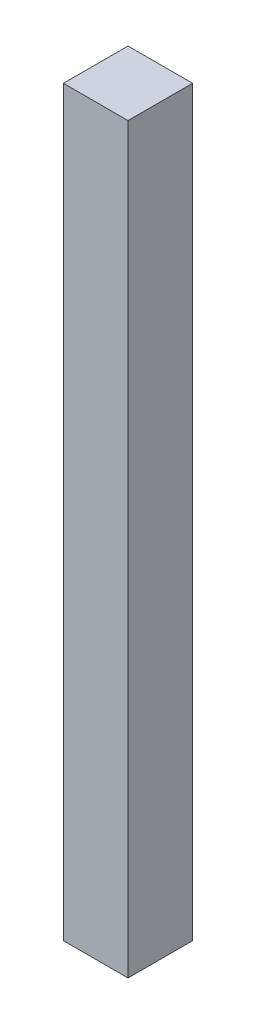
ISO-10303-21;
HEADER;
FILE_DESCRIPTION(('STEP AP214'),'2;1');
FILE_NAME('part.step','',(''),(''),'','','');
FILE_SCHEMA(('AUTOMOTIVE_DESIGN { 1 0 10303 214 1 1 1 1 }'));
ENDSEC;
DATA;
#1=APPLICATION_CONTEXT('core data for automotive mechanical design processes');
#2=APPLICATION_PROTOCOL_DEFINITION('international standard','automotive_design',2000,#1);
#3=PRODUCT_CONTEXT('',#1,'mechanical');
#4=PRODUCT('Part','Part','',(#3));
#5=PRODUCT_RELATED_PRODUCT_CATEGORY('part','',(#4));
#6=PRODUCT_DEFINITION_FORMATION('','',#4);
#7=PRODUCT_DEFINITION_CONTEXT('part definition',#1,'design');
#8=PRODUCT_DEFINITION('design','',#6,#7);
#9=PRODUCT_DEFINITION_SHAPE('','',#8);
#10=(LENGTH_UNIT() NAMED_UNIT(*) SI_UNIT(.MILLI.,.METRE.));
#11=(NAMED_UNIT(*) PLANE_ANGLE_UNIT() SI_UNIT($,.RADIAN.));
#12=(NAMED_UNIT(*) SI_UNIT($,.STERADIAN.) SOLID_ANGLE_UNIT());
#13=UNCERTAINTY_MEASURE_WITH_UNIT(LENGTH_MEASURE(1.E-05),#10,'distance_accuracy_value','');
#14=(GEOMETRIC_REPRESENTATION_CONTEXT(3) GLOBAL_UNCERTAINTY_ASSIGNED_CONTEXT((#13)) GLOBAL_UNIT_ASSIGNED_CONTEXT((#10,
#11,#12)) REPRESENTATION_CONTEXT('',''));
#15=CARTESIAN_POINT('',(0.,0.,0.));
#16=DIRECTION('',(0.,0.,1.));
#17=DIRECTION('',(1.,0.,0.));
#18=AXIS2_PLACEMENT_3D('',#15,#16,#17);
#19=CARTESIAN_POINT('',(50.,-287.5,25.0000000000001));
#20=DIRECTION('',(0.,0.,-1.));
#21=DIRECTION('',(-1.,0.,0.));
#22=AXIS2_PLACEMENT_3D('',#19,#20,#21);
#23=PLANE('',#22);
#24=DIRECTION('',(0.,-1.,0.));
#25=VECTOR('',#24,1.);
#26=CARTESIAN_POINT('',(0.,-287.5,25.0000000000001));
#27=LINE('',#26,#25);
#28=CARTESIAN_POINT('',(0.,287.5,25.0000000000001));
#29=VERTEX_POINT('',#28);
#30=CARTESIAN_POINT('',(0.,-287.5,25.0000000000001));
#31=VERTEX_POINT('',#30);
#32=EDGE_CURVE('E102',#29,#31,#27,.T.);
#33=ORIENTED_EDGE('',*,*,#32,.T.);
#34=DIRECTION('',(-1.,0.,0.));
#35=VECTOR('',#34,1.);
#36=CARTESIAN_POINT('',(50.,-287.5,25.0000000000001));
#37=LINE('',#36,#35);
#38=CARTESIAN_POINT('',(50.,-287.5,25.0000000000001));
#39=VERTEX_POINT('',#38);
#40=EDGE_CURVE('E11',#39,#31,#37,.T.);
#41=ORIENTED_EDGE('',*,*,#40,.F.);
#42=DIRECTION('',(0.,-1.,0.));
#43=VECTOR('',#42,1.);
#44=CARTESIAN_POINT('',(50.,-287.5,25.0000000000001));
#45=LINE('',#44,#43);
#46=CARTESIAN_POINT('',(50.,287.5,25.0000000000001));
#47=VERTEX_POINT('',#46);
#48=EDGE_CURVE('E90',#47,#39,#45,.T.);
#49=ORIENTED_EDGE('',*,*,#48,.F.);
#50=DIRECTION('',(-1.,0.,0.));
#51=VECTOR('',#50,1.);
#52=CARTESIAN_POINT('',(50.,287.5,25.0000000000001));
#53=LINE('',#52,#51);
#54=EDGE_CURVE('E98',#47,#29,#53,.T.);
#55=ORIENTED_EDGE('',*,*,#54,.T.);
#56=EDGE_LOOP('',(#33,#41,#49,#55));
#57=FACE_BOUND('',#56,.T.);
#58=ADVANCED_FACE('F39',(#57),#23,.F.);
#59=CARTESIAN_POINT('',(50.,-287.5,-24.9999999999998));
#60=DIRECTION('',(0.,1.,0.));
#61=DIRECTION('',(0.,0.,1.));
#62=AXIS2_PLACEMENT_3D('',#59,#60,#61);
#63=PLANE('',#62);
#64=DIRECTION('',(0.,0.,-1.));
#65=VECTOR('',#64,1.);
#66=CARTESIAN_POINT('',(0.,-287.5,-24.9999999999998));
#67=LINE('',#66,#65);
#68=CARTESIAN_POINT('',(0.,-287.5,-24.9999999999998));
#69=VERTEX_POINT('',#68);
#70=EDGE_CURVE('E94',#31,#69,#67,.T.);
#71=ORIENTED_EDGE('',*,*,#70,.T.);
#72=DIRECTION('',(-1.,0.,0.));
#73=VECTOR('',#72,1.);
#74=CARTESIAN_POINT('',(50.,-287.5,-24.9999999999998));
#75=LINE('',#74,#73);
#76=CARTESIAN_POINT('',(50.,-287.5,-24.9999999999998));
#77=VERTEX_POINT('',#76);
#78=EDGE_CURVE('E47',#77,#69,#75,.T.);
#79=ORIENTED_EDGE('',*,*,#78,.F.);
#80=DIRECTION('',(0.,0.,-1.));
#81=VECTOR('',#80,1.);
#82=CARTESIAN_POINT('',(50.,-287.5,-24.9999999999998));
#83=LINE('',#82,#81);
#84=EDGE_CURVE('E85',#39,#77,#83,.T.);
#85=ORIENTED_EDGE('',*,*,#84,.F.);
#86=ORIENTED_EDGE('',*,*,#40,.T.);
#87=EDGE_LOOP('',(#71,#79,#85,#86));
#88=FACE_BOUND('',#87,.T.);
#89=ADVANCED_FACE('F93',(#88),#63,.F.);
#90=CARTESIAN_POINT('',(50.,-287.5,-24.9999999999998));
#91=DIRECTION('',(0.,0.,1.));
#92=DIRECTION('',(1.,0.,0.));
#93=AXIS2_PLACEMENT_3D('',#90,#91,#92);
#94=PLANE('',#93);
#95=DIRECTION('',(0.,1.,0.));
#96=VECTOR('',#95,1.);
#97=CARTESIAN_POINT('',(0.,-287.5,-24.9999999999998));
#98=LINE('',#97,#96);
#99=CARTESIAN_POINT('',(0.,287.5,-24.9999999999998));
#100=VERTEX_POINT('',#99);
#101=EDGE_CURVE('E72',#69,#100,#98,.T.);
#102=ORIENTED_EDGE('',*,*,#101,.T.);
#103=DIRECTION('',(-1.,0.,0.));
#104=VECTOR('',#103,1.);
#105=CARTESIAN_POINT('',(50.,287.5,-24.9999999999998));
#106=LINE('',#105,#104);
#107=CARTESIAN_POINT('',(50.,287.5,-24.9999999999998));
#108=VERTEX_POINT('',#107);
#109=EDGE_CURVE('E95',#108,#100,#106,.T.);
#110=ORIENTED_EDGE('',*,*,#109,.F.);
#111=DIRECTION('',(0.,1.,0.));
#112=VECTOR('',#111,1.);
#113=CARTESIAN_POINT('',(50.,-287.5,-24.9999999999998));
#114=LINE('',#113,#112);
#115=EDGE_CURVE('E88',#77,#108,#114,.T.);
#116=ORIENTED_EDGE('',*,*,#115,.F.);
#117=ORIENTED_EDGE('',*,*,#78,.T.);
#118=EDGE_LOOP('',(#102,#110,#116,#117));
#119=FACE_BOUND('',#118,.T.);
#120=ADVANCED_FACE('F96',(#119),#94,.F.);
#121=CARTESIAN_POINT('',(50.,287.5,-24.9999999999998));
#122=DIRECTION('',(0.,-1.,0.));
#123=DIRECTION('',(0.,0.,-1.));
#124=AXIS2_PLACEMENT_3D('',#121,#122,#123);
#125=PLANE('',#124);
#126=DIRECTION('',(0.,0.,1.));
#127=VECTOR('',#126,1.);
#128=CARTESIAN_POINT('',(0.,287.5,-24.9999999999998));
#129=LINE('',#128,#127);
#130=EDGE_CURVE('E78',#100,#29,#129,.T.);
#131=ORIENTED_EDGE('',*,*,#130,.T.);
#132=ORIENTED_EDGE('',*,*,#54,.F.);
#133=DIRECTION('',(0.,0.,1.));
#134=VECTOR('',#133,1.);
#135=CARTESIAN_POINT('',(50.,287.5,-24.9999999999998));
#136=LINE('',#135,#134);
#137=EDGE_CURVE('E55',#108,#47,#136,.T.);
#138=ORIENTED_EDGE('',*,*,#137,.F.);
#139=ORIENTED_EDGE('',*,*,#109,.T.);
#140=EDGE_LOOP('',(#131,#132,#138,#139));
#141=FACE_BOUND('',#140,.T.);
#142=ADVANCED_FACE('F109',(#141),#125,.F.);
#143=CARTESIAN_POINT('',(50.,0.,0.));
#144=DIRECTION('',(1.,0.,0.));
#145=DIRECTION('',(0.,0.,-1.));
#146=AXIS2_PLACEMENT_3D('',#143,#144,#145);
#147=PLANE('',#146);
#148=ORIENTED_EDGE('',*,*,#48,.T.);
#149=ORIENTED_EDGE('',*,*,#84,.T.);
#150=ORIENTED_EDGE('',*,*,#115,.T.);
#151=ORIENTED_EDGE('',*,*,#137,.T.);
#152=EDGE_LOOP('',(#148,#149,#150,#151));
#153=FACE_BOUND('',#152,.T.);
#154=ADVANCED_FACE('F86',(#153),#147,.T.);
#155=CARTESIAN_POINT('',(0.,0.,0.));
#156=DIRECTION('',(1.,0.,0.));
#157=DIRECTION('',(0.,0.,-1.));
#158=AXIS2_PLACEMENT_3D('',#155,#156,#157);
#159=PLANE('',#158);
#160=ORIENTED_EDGE('',*,*,#32,.F.);
#161=ORIENTED_EDGE('',*,*,#130,.F.);
#162=ORIENTED_EDGE('',*,*,#101,.F.);
#163=ORIENTED_EDGE('',*,*,#70,.F.);
#164=EDGE_LOOP('',(#160,#161,#162,#163));
#165=FACE_BOUND('',#164,.T.);
#166=ADVANCED_FACE('F112',(#165),#159,.F.);
#167=CLOSED_SHELL('',(#58,#89,#120,#142,#154,#166));
#168=MANIFOLD_SOLID_BREP('B2',#167);
#169=ADVANCED_BREP_SHAPE_REPRESENTATION('',(#18,#168),#14);
#170=SHAPE_DEFINITION_REPRESENTATION(#9,#169);
ENDSEC;
END-ISO-10303-21;
